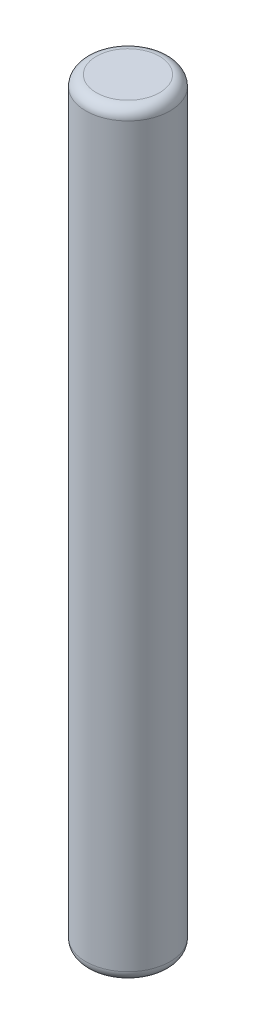
ISO-10303-21;
HEADER;
FILE_DESCRIPTION(('STEP AP214'),'2;1');
FILE_NAME('part.step','',(''),(''),'','','');
FILE_SCHEMA(('AUTOMOTIVE_DESIGN { 1 0 10303 214 1 1 1 1 }'));
ENDSEC;
DATA;
#1=APPLICATION_CONTEXT('core data for automotive mechanical design processes');
#2=APPLICATION_PROTOCOL_DEFINITION('international standard','automotive_design',2000,#1);
#3=PRODUCT_CONTEXT('',#1,'mechanical');
#4=PRODUCT('Part','Part','',(#3));
#5=PRODUCT_RELATED_PRODUCT_CATEGORY('part','',(#4));
#6=PRODUCT_DEFINITION_FORMATION('','',#4);
#7=PRODUCT_DEFINITION_CONTEXT('part definition',#1,'design');
#8=PRODUCT_DEFINITION('design','',#6,#7);
#9=PRODUCT_DEFINITION_SHAPE('','',#8);
#10=(LENGTH_UNIT() NAMED_UNIT(*) SI_UNIT(.MILLI.,.METRE.));
#11=(NAMED_UNIT(*) PLANE_ANGLE_UNIT() SI_UNIT($,.RADIAN.));
#12=(NAMED_UNIT(*) SI_UNIT($,.STERADIAN.) SOLID_ANGLE_UNIT());
#13=UNCERTAINTY_MEASURE_WITH_UNIT(LENGTH_MEASURE(1.E-05),#10,'distance_accuracy_value','');
#14=(GEOMETRIC_REPRESENTATION_CONTEXT(3) GLOBAL_UNCERTAINTY_ASSIGNED_CONTEXT((#13)) GLOBAL_UNIT_ASSIGNED_CONTEXT((#10,
#11,#12)) REPRESENTATION_CONTEXT('',''));
#15=CARTESIAN_POINT('',(0.,0.,0.));
#16=DIRECTION('',(0.,0.,1.));
#17=DIRECTION('',(1.,0.,0.));
#18=AXIS2_PLACEMENT_3D('',#15,#16,#17);
#19=CARTESIAN_POINT('',(0.,18.,0.));
#20=DIRECTION('',(0.,-1.,0.));
#21=DIRECTION('',(0.,0.,-1.00000000000001));
#22=AXIS2_PLACEMENT_3D('',#19,#20,#21);
#23=CYLINDRICAL_SURFACE('',#22,1.);
#24=CARTESIAN_POINT('',(0.,0.25,0.));
#25=DIRECTION('',(0.,1.,0.));
#26=DIRECTION('',(0.,0.,1.00000000000001));
#27=AXIS2_PLACEMENT_3D('',#24,#25,#26);
#28=CIRCLE('',#27,1.);
#29=CARTESIAN_POINT('',(0.,0.25,1.00000000000001));
#30=VERTEX_POINT('',#29);
#31=EDGE_CURVE('E43',#30,#30,#28,.T.);
#32=ORIENTED_EDGE('',*,*,#31,.T.);
#33=EDGE_LOOP('',(#32));
#34=FACE_BOUND('',#33,.T.);
#35=CARTESIAN_POINT('',(0.,17.75,0.));
#36=DIRECTION('',(0.,1.,0.));
#37=DIRECTION('',(0.,0.,1.00000000000001));
#38=AXIS2_PLACEMENT_3D('',#35,#36,#37);
#39=CIRCLE('',#38,1.);
#40=CARTESIAN_POINT('',(0.,17.75,1.));
#41=VERTEX_POINT('',#40);
#42=EDGE_CURVE('E47',#41,#41,#39,.F.);
#43=ORIENTED_EDGE('',*,*,#42,.T.);
#44=EDGE_LOOP('',(#43));
#45=FACE_BOUND('',#44,.T.);
#46=ADVANCED_FACE('F32',(#34,#45),#23,.T.);
#47=CARTESIAN_POINT('',(0.,18.,0.));
#48=DIRECTION('',(0.,1.,0.));
#49=DIRECTION('',(0.,0.,1.00000000000001));
#50=AXIS2_PLACEMENT_3D('',#47,#48,#49);
#51=PLANE('',#50);
#52=CARTESIAN_POINT('',(0.,18.,0.));
#53=DIRECTION('',(0.,1.,0.));
#54=DIRECTION('',(0.,0.,1.00000000000001));
#55=AXIS2_PLACEMENT_3D('',#52,#53,#54);
#56=CIRCLE('',#55,0.75);
#57=CARTESIAN_POINT('',(0.,18.,0.750000000000008));
#58=VERTEX_POINT('',#57);
#59=EDGE_CURVE('E10',#58,#58,#56,.T.);
#60=ORIENTED_EDGE('',*,*,#59,.T.);
#61=EDGE_LOOP('',(#60));
#62=FACE_BOUND('',#61,.T.);
#63=ADVANCED_FACE('F63',(#62),#51,.T.);
#64=CARTESIAN_POINT('',(0.,0.,0.));
#65=DIRECTION('',(0.,1.,0.));
#66=DIRECTION('',(0.,0.,1.00000000000001));
#67=AXIS2_PLACEMENT_3D('',#64,#65,#66);
#68=PLANE('',#67);
#69=CARTESIAN_POINT('',(0.,0.,0.));
#70=DIRECTION('',(0.,1.,0.));
#71=DIRECTION('',(0.,0.,1.00000000000001));
#72=AXIS2_PLACEMENT_3D('',#69,#70,#71);
#73=CIRCLE('',#72,0.75);
#74=CARTESIAN_POINT('',(0.,0.,0.750000000000005));
#75=VERTEX_POINT('',#74);
#76=EDGE_CURVE('E39',#75,#75,#73,.F.);
#77=ORIENTED_EDGE('',*,*,#76,.T.);
#78=EDGE_LOOP('',(#77));
#79=FACE_BOUND('',#78,.T.);
#80=ADVANCED_FACE('F60',(#79),#68,.F.);
#81=CARTESIAN_POINT('',(0.,0.25,0.));
#82=DIRECTION('',(0.,1.,0.));
#83=DIRECTION('',(0.,0.,1.00000000000001));
#84=AXIS2_PLACEMENT_3D('',#81,#82,#83);
#85=TOROIDAL_SURFACE('',#84,0.75,0.25);
#86=ORIENTED_EDGE('',*,*,#76,.F.);
#87=EDGE_LOOP('',(#86));
#88=FACE_BOUND('',#87,.T.);
#89=ORIENTED_EDGE('',*,*,#31,.F.);
#90=EDGE_LOOP('',(#89));
#91=FACE_BOUND('',#90,.T.);
#92=ADVANCED_FACE('F56',(#88,#91),#85,.T.);
#93=CARTESIAN_POINT('',(0.,17.75,0.));
#94=DIRECTION('',(0.,1.,0.));
#95=DIRECTION('',(0.,0.,1.00000000000001));
#96=AXIS2_PLACEMENT_3D('',#93,#94,#95);
#97=TOROIDAL_SURFACE('',#96,0.75,0.25);
#98=ORIENTED_EDGE('',*,*,#42,.F.);
#99=EDGE_LOOP('',(#98));
#100=FACE_BOUND('',#99,.T.);
#101=ORIENTED_EDGE('',*,*,#59,.F.);
#102=EDGE_LOOP('',(#101));
#103=FACE_BOUND('',#102,.T.);
#104=ADVANCED_FACE('F34',(#100,#103),#97,.T.);
#105=CLOSED_SHELL('',(#46,#63,#80,#92,#104));
#106=MANIFOLD_SOLID_BREP('B2',#105);
#107=ADVANCED_BREP_SHAPE_REPRESENTATION('',(#18,#106),#14);
#108=SHAPE_DEFINITION_REPRESENTATION(#9,#107);
ENDSEC;
END-ISO-10303-21;
